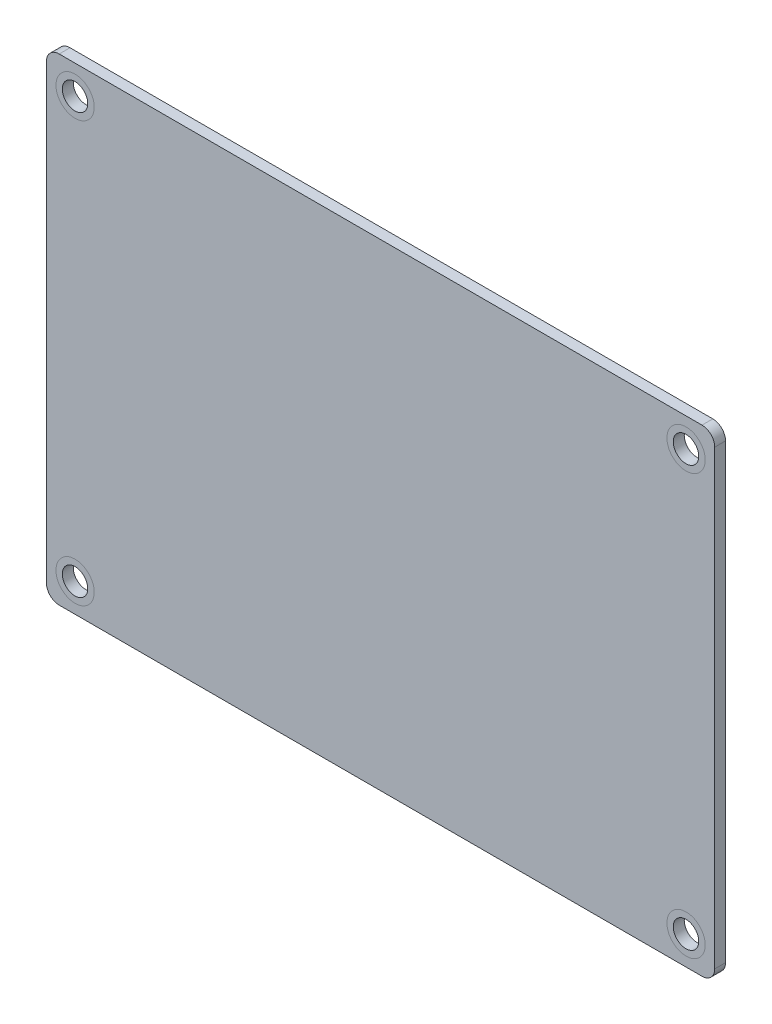
ISO-10303-21;
HEADER;
FILE_DESCRIPTION(('STEP AP214'),'2;1');
FILE_NAME('part.step','',(''),(''),'','','');
FILE_SCHEMA(('AUTOMOTIVE_DESIGN { 1 0 10303 214 1 1 1 1 }'));
ENDSEC;
DATA;
#1=APPLICATION_CONTEXT('core data for automotive mechanical design processes');
#2=APPLICATION_PROTOCOL_DEFINITION('international standard','automotive_design',2000,#1);
#3=PRODUCT_CONTEXT('',#1,'mechanical');
#4=PRODUCT('Part','Part','',(#3));
#5=PRODUCT_RELATED_PRODUCT_CATEGORY('part','',(#4));
#6=PRODUCT_DEFINITION_FORMATION('','',#4);
#7=PRODUCT_DEFINITION_CONTEXT('part definition',#1,'design');
#8=PRODUCT_DEFINITION('design','',#6,#7);
#9=PRODUCT_DEFINITION_SHAPE('','',#8);
#10=(LENGTH_UNIT() NAMED_UNIT(*) SI_UNIT(.MILLI.,.METRE.));
#11=(NAMED_UNIT(*) PLANE_ANGLE_UNIT() SI_UNIT($,.RADIAN.));
#12=(NAMED_UNIT(*) SI_UNIT($,.STERADIAN.) SOLID_ANGLE_UNIT());
#13=UNCERTAINTY_MEASURE_WITH_UNIT(LENGTH_MEASURE(1.E-05),#10,'distance_accuracy_value','');
#14=(GEOMETRIC_REPRESENTATION_CONTEXT(3) GLOBAL_UNCERTAINTY_ASSIGNED_CONTEXT((#13)) GLOBAL_UNIT_ASSIGNED_CONTEXT((#10,
#11,#12)) REPRESENTATION_CONTEXT('',''));
#15=CARTESIAN_POINT('',(0.,0.,0.));
#16=DIRECTION('',(0.,0.,1.));
#17=DIRECTION('',(1.,0.,0.));
#18=AXIS2_PLACEMENT_3D('',#15,#16,#17);
#19=CARTESIAN_POINT('',(-45.,40.,1.7));
#20=DIRECTION('',(1.,0.,0.));
#21=DIRECTION('',(0.,1.,0.));
#22=AXIS2_PLACEMENT_3D('',#19,#20,#21);
#23=PLANE('',#22);
#24=DIRECTION('',(0.,0.,-1.));
#25=VECTOR('',#24,1.);
#26=CARTESIAN_POINT('',(-45.00000000001,-33.00000000001,1.70000000001));
#27=LINE('',#26,#25);
#28=CARTESIAN_POINT('',(-45.,-33.,1.7));
#29=VERTEX_POINT('',#28);
#30=CARTESIAN_POINT('',(-45.,-33.,0.));
#31=VERTEX_POINT('',#30);
#32=EDGE_CURVE('E42',#29,#31,#27,.T.);
#33=ORIENTED_EDGE('',*,*,#32,.F.);
#34=DIRECTION('',(0.,1.,0.));
#35=VECTOR('',#34,1.);
#36=CARTESIAN_POINT('',(-45.00000000001,-33.00000000001,1.70000000001));
#37=LINE('',#36,#35);
#38=CARTESIAN_POINT('',(-45.,38.,1.7));
#39=VERTEX_POINT('',#38);
#40=EDGE_CURVE('E11',#29,#39,#37,.T.);
#41=ORIENTED_EDGE('',*,*,#40,.T.);
#42=DIRECTION('',(0.,0.,1.));
#43=VECTOR('',#42,1.);
#44=CARTESIAN_POINT('',(-45.00000000001,38.00000000001,0.));
#45=LINE('',#44,#43);
#46=CARTESIAN_POINT('',(-45.,38.,0.));
#47=VERTEX_POINT('',#46);
#48=EDGE_CURVE('E381',#47,#39,#45,.T.);
#49=ORIENTED_EDGE('',*,*,#48,.F.);
#50=DIRECTION('',(0.,1.,0.));
#51=VECTOR('',#50,1.);
#52=CARTESIAN_POINT('',(-45.00000000001,-33.00000000001,0.));
#53=LINE('',#52,#51);
#54=EDGE_CURVE('E377',#31,#47,#53,.T.);
#55=ORIENTED_EDGE('',*,*,#54,.F.);
#56=EDGE_LOOP('',(#33,#41,#49,#55));
#57=FACE_BOUND('',#56,.T.);
#58=ADVANCED_FACE('F17',(#57),#23,.F.);
#59=CARTESIAN_POINT('',(7.5,2.5,0.));
#60=DIRECTION('',(0.,0.,1.));
#61=DIRECTION('',(1.,0.,0.));
#62=AXIS2_PLACEMENT_3D('',#59,#60,#61);
#63=PLANE('',#62);
#64=CARTESIAN_POINT('',(-43.00000000001,-33.00000000001,0.));
#65=DIRECTION('',(0.,0.,-1.));
#66=DIRECTION('',(0.,-1.,0.));
#67=AXIS2_PLACEMENT_3D('',#64,#65,#66);
#68=CIRCLE('',#67,2.00000000001);
#69=CARTESIAN_POINT('',(-43.,-35.,0.));
#70=VERTEX_POINT('',#69);
#71=EDGE_CURVE('E30',#70,#31,#68,.T.);
#72=ORIENTED_EDGE('',*,*,#71,.T.);
#73=ORIENTED_EDGE('',*,*,#54,.T.);
#74=CARTESIAN_POINT('',(-43.00000000001,38.00000000001,0.));
#75=DIRECTION('',(0.,0.,-1.));
#76=DIRECTION('',(-1.,0.,0.));
#77=AXIS2_PLACEMENT_3D('',#74,#75,#76);
#78=CIRCLE('',#77,2.00000000001);
#79=CARTESIAN_POINT('',(-43.,40.,0.));
#80=VERTEX_POINT('',#79);
#81=EDGE_CURVE('E386',#47,#80,#78,.T.);
#82=ORIENTED_EDGE('',*,*,#81,.T.);
#83=DIRECTION('',(1.,0.,0.));
#84=VECTOR('',#83,1.);
#85=CARTESIAN_POINT('',(-43.00000000001,40.00000000001,0.));
#86=LINE('',#85,#84);
#87=CARTESIAN_POINT('',(58.,40.,0.));
#88=VERTEX_POINT('',#87);
#89=EDGE_CURVE('E136',#80,#88,#86,.T.);
#90=ORIENTED_EDGE('',*,*,#89,.T.);
#91=CARTESIAN_POINT('',(58.00000000001,38.00000000001,0.));
#92=DIRECTION('',(0.,0.,-1.));
#93=DIRECTION('',(0.,1.,0.));
#94=AXIS2_PLACEMENT_3D('',#91,#92,#93);
#95=CIRCLE('',#94,2.00000000001);
#96=CARTESIAN_POINT('',(60.,38.,0.));
#97=VERTEX_POINT('',#96);
#98=EDGE_CURVE('E128',#88,#97,#95,.T.);
#99=ORIENTED_EDGE('',*,*,#98,.T.);
#100=DIRECTION('',(0.,-1.,0.));
#101=VECTOR('',#100,1.);
#102=CARTESIAN_POINT('',(60.00000000001,38.00000000001,0.));
#103=LINE('',#102,#101);
#104=CARTESIAN_POINT('',(60.,-33.,0.));
#105=VERTEX_POINT('',#104);
#106=EDGE_CURVE('E336',#97,#105,#103,.T.);
#107=ORIENTED_EDGE('',*,*,#106,.T.);
#108=CARTESIAN_POINT('',(58.00000000001,-33.00000000001,0.));
#109=DIRECTION('',(0.,0.,-1.));
#110=DIRECTION('',(1.,0.,0.));
#111=AXIS2_PLACEMENT_3D('',#108,#109,#110);
#112=CIRCLE('',#111,2.00000000001);
#113=CARTESIAN_POINT('',(58.,-35.,0.));
#114=VERTEX_POINT('',#113);
#115=EDGE_CURVE('E340',#105,#114,#112,.T.);
#116=ORIENTED_EDGE('',*,*,#115,.T.);
#117=DIRECTION('',(-1.,0.,0.));
#118=VECTOR('',#117,1.);
#119=CARTESIAN_POINT('',(58.00000000001,-35.00000000001,0.));
#120=LINE('',#119,#118);
#121=EDGE_CURVE('E341',#114,#70,#120,.T.);
#122=ORIENTED_EDGE('',*,*,#121,.T.);
#123=EDGE_LOOP('',(#72,#73,#82,#90,#99,#107,#116,#122));
#124=FACE_BOUND('',#123,.T.);
#125=CARTESIAN_POINT('',(-37.50000000001,35.50000000001,-0.01));
#126=CARTESIAN_POINT('',(-37.5056913672193,34.2515518188258,-0.01));
#127=CARTESIAN_POINT('',(-38.3801267730283,33.3772478594267,-0.01));
#128=CARTESIAN_POINT('',(-39.2521991783295,32.5053065453256,-0.01));
#129=CARTESIAN_POINT('',(-40.4881974694983,32.5000405906666,-0.01));
#130=CARTESIAN_POINT('',(-41.7250646658958,32.4947709340483,-0.01));
#131=CARTESIAN_POINT('',(-42.6067692264733,33.364245327,-0.01));
#132=CARTESIAN_POINT('',(-43.4959996175382,34.2411411592716,-0.01));
#133=CARTESIAN_POINT('',(-43.50000000001,35.50000000001,-0.01));
#134=B_SPLINE_CURVE_WITH_KNOTS('',2,(#125,#126,#127,#128,#129,#130,#131,#132,#133),
.UNSPECIFIED.,.F.,.F.,(3,2,2,2,3),(0.,0.25,0.5,0.75,1.),.UNSPECIFIED.);
#135=CARTESIAN_POINT('',(-37.5,35.5,-0.005));
#136=VERTEX_POINT('',#135);
#137=CARTESIAN_POINT('',(-43.5,35.5,-0.005));
#138=VERTEX_POINT('',#137);
#139=EDGE_CURVE('E912',#136,#138,#134,.T.);
#140=ORIENTED_EDGE('',*,*,#139,.F.);
#141=CARTESIAN_POINT('',(-43.50000000001,35.50000000001,-0.01));
#142=CARTESIAN_POINT('',(-43.4943086328007,36.7484481811896,-0.01));
#143=CARTESIAN_POINT('',(-42.6198732269917,37.6227521405933,-0.01));
#144=CARTESIAN_POINT('',(-41.7478008216904,38.494693454699,-0.01));
#145=CARTESIAN_POINT('',(-40.5118025305217,38.4999594093533,-0.01));
#146=CARTESIAN_POINT('',(-39.2749353341196,38.5052290659672,-0.01));
#147=CARTESIAN_POINT('',(-38.3932307735467,37.63575467302,-0.01));
#148=CARTESIAN_POINT('',(-37.5040003824818,36.7588588407484,-0.01));
#149=CARTESIAN_POINT('',(-37.50000000001,35.50000000001,-0.01));
#150=B_SPLINE_CURVE_WITH_KNOTS('',2,(#141,#142,#143,#144,#145,#146,#147,#148,#149),
.UNSPECIFIED.,.F.,.F.,(3,2,2,2,3),(0.,0.25,0.5,0.75,1.),.UNSPECIFIED.);
#151=EDGE_CURVE('E320',#138,#136,#150,.T.);
#152=ORIENTED_EDGE('',*,*,#151,.F.);
#153=EDGE_LOOP('',(#140,#152));
#154=FACE_BOUND('',#153,.T.);
#155=CARTESIAN_POINT('',(58.50000000001,-30.50000000001,-0.01));
#156=CARTESIAN_POINT('',(58.4943086328008,-31.7484481811804,-0.01));
#157=CARTESIAN_POINT('',(57.6198732269917,-32.6227521405933,-0.01));
#158=CARTESIAN_POINT('',(56.747800821695,-33.4946934547035,-0.01));
#159=CARTESIAN_POINT('',(55.5118025305217,-33.4999594093533,-0.01));
#160=CARTESIAN_POINT('',(54.2749353341104,-33.5052290659626,-0.01));
#161=CARTESIAN_POINT('',(53.3932307735467,-32.63575467302,-0.01));
#162=CARTESIAN_POINT('',(52.5040003824818,-31.7588588407438,-0.01));
#163=CARTESIAN_POINT('',(52.50000000001,-30.50000000001,-0.01));
#164=B_SPLINE_CURVE_WITH_KNOTS('',2,(#155,#156,#157,#158,#159,#160,#161,#162,#163),
.UNSPECIFIED.,.F.,.F.,(3,2,2,2,3),(0.,0.25,0.5,0.75,1.),.UNSPECIFIED.);
#165=CARTESIAN_POINT('',(58.5,-30.5,-0.005));
#166=VERTEX_POINT('',#165);
#167=CARTESIAN_POINT('',(52.5,-30.5,-0.005));
#168=VERTEX_POINT('',#167);
#169=EDGE_CURVE('E366',#166,#168,#164,.T.);
#170=ORIENTED_EDGE('',*,*,#169,.F.);
#171=CARTESIAN_POINT('',(52.50000000001,-30.50000000001,-0.01));
#172=CARTESIAN_POINT('',(52.5056913672192,-29.2515518188373,-0.01));
#173=CARTESIAN_POINT('',(53.3801267730283,-28.3772478594267,-0.01));
#174=CARTESIAN_POINT('',(54.2521991783226,-27.5053065453211,-0.01));
#175=CARTESIAN_POINT('',(55.4881974694983,-27.5000405906667,-0.01));
#176=CARTESIAN_POINT('',(56.7250646659027,-27.4947709340528,-0.01));
#177=CARTESIAN_POINT('',(57.6067692264733,-28.364245327,-0.01));
#178=CARTESIAN_POINT('',(58.4959996175382,-29.241141159274,-0.01));
#179=CARTESIAN_POINT('',(58.50000000001,-30.50000000001,-0.01));
#180=B_SPLINE_CURVE_WITH_KNOTS('',2,(#171,#172,#173,#174,#175,#176,#177,#178,#179),
.UNSPECIFIED.,.F.,.F.,(3,2,2,2,3),(0.,0.25,0.5,0.75,1.),.UNSPECIFIED.);
#181=EDGE_CURVE('E350',#168,#166,#180,.T.);
#182=ORIENTED_EDGE('',*,*,#181,.F.);
#183=EDGE_LOOP('',(#170,#182));
#184=FACE_BOUND('',#183,.T.);
#185=CARTESIAN_POINT('',(58.50000000001,35.50000000001,-0.01));
#186=CARTESIAN_POINT('',(58.4943086328007,34.2515518188304,-0.01));
#187=CARTESIAN_POINT('',(57.6198732269917,33.3772478594267,-0.01));
#188=CARTESIAN_POINT('',(56.747800821695,32.5053065453256,-0.01));
#189=CARTESIAN_POINT('',(55.5118025305217,32.5000405906666,-0.01));
#190=CARTESIAN_POINT('',(54.2749353341196,32.4947709340482,-0.01));
#191=CARTESIAN_POINT('',(53.3932307735467,33.364245327,-0.01));
#192=CARTESIAN_POINT('',(52.5040003824818,34.2411411592762,-0.01));
#193=CARTESIAN_POINT('',(52.50000000001,35.50000000001,-0.01));
#194=B_SPLINE_CURVE_WITH_KNOTS('',2,(#185,#186,#187,#188,#189,#190,#191,#192,#193),
.UNSPECIFIED.,.F.,.F.,(3,2,2,2,3),(0.,0.25,0.5,0.75,1.),.UNSPECIFIED.);
#195=CARTESIAN_POINT('',(58.5,35.5,-0.005));
#196=VERTEX_POINT('',#195);
#197=CARTESIAN_POINT('',(52.5,35.5,-0.005));
#198=VERTEX_POINT('',#197);
#199=EDGE_CURVE('E309',#196,#198,#194,.T.);
#200=ORIENTED_EDGE('',*,*,#199,.F.);
#201=CARTESIAN_POINT('',(52.50000000001,35.50000000001,-0.01));
#202=CARTESIAN_POINT('',(52.5056913672192,36.748448181185,-0.01));
#203=CARTESIAN_POINT('',(53.3801267730283,37.6227521405933,-0.01));
#204=CARTESIAN_POINT('',(54.252199178325,38.4946934546989,-0.01));
#205=CARTESIAN_POINT('',(55.4881974694983,38.4999594093533,-0.01));
#206=CARTESIAN_POINT('',(56.7250646658959,38.5052290659672,-0.01));
#207=CARTESIAN_POINT('',(57.6067692264733,37.63575467302,-0.01));
#208=CARTESIAN_POINT('',(58.4959996175382,36.7588588407529,-0.01));
#209=CARTESIAN_POINT('',(58.50000000001,35.50000000001,-0.01));
#210=B_SPLINE_CURVE_WITH_KNOTS('',2,(#201,#202,#203,#204,#205,#206,#207,#208,#209),
.UNSPECIFIED.,.F.,.F.,(3,2,2,2,3),(0.,0.25,0.5,0.75,1.),.UNSPECIFIED.);
#211=EDGE_CURVE('E335',#198,#196,#210,.T.);
#212=ORIENTED_EDGE('',*,*,#211,.F.);
#213=EDGE_LOOP('',(#200,#212));
#214=FACE_BOUND('',#213,.T.);
#215=CARTESIAN_POINT('',(-37.50000000001,-30.50000000001,-0.01));
#216=CARTESIAN_POINT('',(-37.5056913672192,-31.748448181185,-0.01));
#217=CARTESIAN_POINT('',(-38.3801267730283,-32.6227521405933,-0.01));
#218=CARTESIAN_POINT('',(-39.2521991783295,-33.4946934547035,-0.01));
#219=CARTESIAN_POINT('',(-40.4881974694983,-33.4999594093533,-0.01));
#220=CARTESIAN_POINT('',(-41.7250646659051,-33.5052290659626,-0.01));
#221=CARTESIAN_POINT('',(-42.6067692264733,-32.63575467302,-0.01));
#222=CARTESIAN_POINT('',(-43.4959996175382,-31.7588588407484,-0.01));
#223=CARTESIAN_POINT('',(-43.50000000001,-30.50000000001,-0.01));
#224=B_SPLINE_CURVE_WITH_KNOTS('',2,(#215,#216,#217,#218,#219,#220,#221,#222,#223),
.UNSPECIFIED.,.F.,.F.,(3,2,2,2,3),(0.,0.25,0.5,0.75,1.),.UNSPECIFIED.);
#225=CARTESIAN_POINT('',(-37.5,-30.5,-0.005));
#226=VERTEX_POINT('',#225);
#227=CARTESIAN_POINT('',(-43.5,-30.5,-0.005));
#228=VERTEX_POINT('',#227);
#229=EDGE_CURVE('E370',#226,#228,#224,.T.);
#230=ORIENTED_EDGE('',*,*,#229,.F.);
#231=CARTESIAN_POINT('',(-43.50000000001,-30.50000000001,-0.01));
#232=CARTESIAN_POINT('',(-43.4943086328007,-29.2515518188327,-0.01));
#233=CARTESIAN_POINT('',(-42.6198732269917,-28.3772478594267,-0.01));
#234=CARTESIAN_POINT('',(-41.7478008216927,-27.505306545321,-0.01));
#235=CARTESIAN_POINT('',(-40.5118025305217,-27.5000405906667,-0.01));
#236=CARTESIAN_POINT('',(-39.2749353341127,-27.4947709340528,-0.01));
#237=CARTESIAN_POINT('',(-38.3932307735467,-28.364245327,-0.01));
#238=CARTESIAN_POINT('',(-37.5040003824818,-29.2411411592785,-0.01));
#239=CARTESIAN_POINT('',(-37.50000000001,-30.50000000001,-0.01));
#240=B_SPLINE_CURVE_WITH_KNOTS('',2,(#231,#232,#233,#234,#235,#236,#237,#238,#239),
.UNSPECIFIED.,.F.,.F.,(3,2,2,2,3),(0.,0.25,0.5,0.75,1.),.UNSPECIFIED.);
#241=EDGE_CURVE('E344',#228,#226,#240,.T.);
#242=ORIENTED_EDGE('',*,*,#241,.F.);
#243=EDGE_LOOP('',(#230,#242));
#244=FACE_BOUND('',#243,.T.);
#245=ADVANCED_FACE('F412',(#124,#154,#184,#214,#244),#63,.F.);
#246=CARTESIAN_POINT('',(-40.5,-30.5,-0.01));
#247=DIRECTION('',(0.,0.,1.));
#248=DIRECTION('',(1.,0.,0.));
#249=AXIS2_PLACEMENT_3D('',#246,#247,#248);
#250=PLANE('',#249);
#251=ORIENTED_EDGE('',*,*,#241,.T.);
#252=ORIENTED_EDGE('',*,*,#229,.T.);
#253=EDGE_LOOP('',(#251,#252));
#254=FACE_BOUND('',#253,.T.);
#255=CARTESIAN_POINT('',(-40.50000000001,-30.50000000001,-0.01000000001));
#256=DIRECTION('',(0.,0.,1.));
#257=DIRECTION('',(-1.,0.,0.));
#258=AXIS2_PLACEMENT_3D('',#255,#256,#257);
#259=CIRCLE('',#258,2.00000000001);
#260=CARTESIAN_POINT('',(-42.50000000002,-30.50000000001,-0.01000000001));
#261=VERTEX_POINT('',#260);
#262=EDGE_CURVE('E359',#261,#261,#259,.T.);
#263=ORIENTED_EDGE('',*,*,#262,.T.);
#264=EDGE_LOOP('',(#263));
#265=FACE_BOUND('',#264,.T.);
#266=ADVANCED_FACE('F401',(#254,#265),#250,.F.);
#267=CARTESIAN_POINT('',(-40.5,-30.5,1.7));
#268=DIRECTION('',(0.,0.,-1.));
#269=DIRECTION('',(-1.,0.,0.));
#270=AXIS2_PLACEMENT_3D('',#267,#268,#269);
#271=CYLINDRICAL_SURFACE('',#270,2.);
#272=ORIENTED_EDGE('',*,*,#262,.F.);
#273=EDGE_LOOP('',(#272));
#274=FACE_BOUND('',#273,.T.);
#275=CARTESIAN_POINT('',(-40.50000000001,-30.50000000001,1.71000000001));
#276=DIRECTION('',(0.,0.,-1.));
#277=DIRECTION('',(-1.,0.,0.));
#278=AXIS2_PLACEMENT_3D('',#275,#276,#277);
#279=CIRCLE('',#278,2.00000000001);
#280=CARTESIAN_POINT('',(-42.50000000002,-30.50000000001,1.71000000001));
#281=VERTEX_POINT('',#280);
#282=EDGE_CURVE('E325',#281,#281,#279,.T.);
#283=ORIENTED_EDGE('',*,*,#282,.F.);
#284=EDGE_LOOP('',(#283));
#285=FACE_BOUND('',#284,.T.);
#286=ADVANCED_FACE('F411',(#274,#285),#271,.F.);
#287=CARTESIAN_POINT('',(-40.5,-30.5,1.71));
#288=DIRECTION('',(0.,0.,1.));
#289=DIRECTION('',(1.,0.,0.));
#290=AXIS2_PLACEMENT_3D('',#287,#288,#289);
#291=PLANE('',#290);
#292=CARTESIAN_POINT('',(-37.50000000001,-30.50000000001,1.7));
#293=CARTESIAN_POINT('',(-37.5056913672193,-31.748448181185,1.7));
#294=CARTESIAN_POINT('',(-38.3801267730283,-32.6227521405933,1.7));
#295=CARTESIAN_POINT('',(-39.2521991783296,-33.4946934547035,1.7));
#296=CARTESIAN_POINT('',(-40.4881974694983,-33.4999594093534,1.7));
#297=CARTESIAN_POINT('',(-41.7250646659051,-33.5052290659626,1.7));
#298=CARTESIAN_POINT('',(-42.6067692264733,-32.63575467302,1.7));
#299=CARTESIAN_POINT('',(-43.4959996175382,-31.7588588407484,1.7));
#300=CARTESIAN_POINT('',(-43.50000000001,-30.50000000001,1.7));
#301=B_SPLINE_CURVE_WITH_KNOTS('',2,(#292,#293,#294,#295,#296,#297,#298,#299,#300),
.UNSPECIFIED.,.F.,.F.,(3,2,2,2,3),(0.,0.25,0.5,0.75,1.),.UNSPECIFIED.);
#302=CARTESIAN_POINT('',(-37.5,-30.5,1.705));
#303=VERTEX_POINT('',#302);
#304=CARTESIAN_POINT('',(-43.5,-30.5,1.705));
#305=VERTEX_POINT('',#304);
#306=EDGE_CURVE('E178',#303,#305,#301,.T.);
#307=ORIENTED_EDGE('',*,*,#306,.F.);
#308=CARTESIAN_POINT('',(-43.50000000001,-30.50000000001,1.7));
#309=CARTESIAN_POINT('',(-43.4943086328007,-29.2515518188327,1.7));
#310=CARTESIAN_POINT('',(-42.6198732269917,-28.3772478594267,1.7));
#311=CARTESIAN_POINT('',(-41.7478008216927,-27.505306545321,1.7));
#312=CARTESIAN_POINT('',(-40.5118025305217,-27.5000405906667,1.7));
#313=CARTESIAN_POINT('',(-39.2749353341127,-27.4947709340528,1.7));
#314=CARTESIAN_POINT('',(-38.3932307735467,-28.364245327,1.7));
#315=CARTESIAN_POINT('',(-37.5040003824818,-29.2411411592785,1.7));
#316=CARTESIAN_POINT('',(-37.50000000001,-30.50000000001,1.7));
#317=B_SPLINE_CURVE_WITH_KNOTS('',2,(#308,#309,#310,#311,#312,#313,#314,#315,#316),
.UNSPECIFIED.,.F.,.F.,(3,2,2,2,3),(0.,0.25,0.5,0.75,1.),.UNSPECIFIED.);
#318=EDGE_CURVE('E183',#305,#303,#317,.T.);
#319=ORIENTED_EDGE('',*,*,#318,.F.);
#320=EDGE_LOOP('',(#307,#319));
#321=FACE_BOUND('',#320,.T.);
#322=ORIENTED_EDGE('',*,*,#282,.T.);
#323=EDGE_LOOP('',(#322));
#324=FACE_BOUND('',#323,.T.);
#325=ADVANCED_FACE('F181',(#321,#324),#291,.T.);
#326=CARTESIAN_POINT('',(7.5,2.5,1.7));
#327=DIRECTION('',(0.,0.,1.));
#328=DIRECTION('',(1.,0.,0.));
#329=AXIS2_PLACEMENT_3D('',#326,#327,#328);
#330=PLANE('',#329);
#331=CARTESIAN_POINT('',(-43.00000000001,-33.00000000001,1.70000000001));
#332=DIRECTION('',(0.,0.,1.));
#333=DIRECTION('',(-1.,0.,0.));
#334=AXIS2_PLACEMENT_3D('',#331,#332,#333);
#335=CIRCLE('',#334,2.00000000001);
#336=CARTESIAN_POINT('',(-43.,-35.,1.7));
#337=VERTEX_POINT('',#336);
#338=EDGE_CURVE('E321',#29,#337,#335,.T.);
#339=ORIENTED_EDGE('',*,*,#338,.T.);
#340=DIRECTION('',(-1.,0.,0.));
#341=VECTOR('',#340,1.);
#342=CARTESIAN_POINT('',(58.00000000001,-35.00000000001,1.70000000001));
#343=LINE('',#342,#341);
#344=CARTESIAN_POINT('',(58.,-35.,1.7));
#345=VERTEX_POINT('',#344);
#346=EDGE_CURVE('E316',#345,#337,#343,.T.);
#347=ORIENTED_EDGE('',*,*,#346,.F.);
#348=CARTESIAN_POINT('',(58.00000000001,-33.00000000001,1.70000000001));
#349=DIRECTION('',(0.,0.,1.));
#350=DIRECTION('',(0.,-1.,0.));
#351=AXIS2_PLACEMENT_3D('',#348,#349,#350);
#352=CIRCLE('',#351,2.00000000001);
#353=CARTESIAN_POINT('',(60.,-33.,1.7));
#354=VERTEX_POINT('',#353);
#355=EDGE_CURVE('E301',#345,#354,#352,.T.);
#356=ORIENTED_EDGE('',*,*,#355,.T.);
#357=DIRECTION('',(0.,-1.,0.));
#358=VECTOR('',#357,1.);
#359=CARTESIAN_POINT('',(60.00000000001,38.00000000001,1.70000000001));
#360=LINE('',#359,#358);
#361=CARTESIAN_POINT('',(60.,38.,1.7));
#362=VERTEX_POINT('',#361);
#363=EDGE_CURVE('E326',#362,#354,#360,.T.);
#364=ORIENTED_EDGE('',*,*,#363,.F.);
#365=CARTESIAN_POINT('',(58.00000000001,38.00000000001,1.70000000001));
#366=DIRECTION('',(0.,0.,1.));
#367=DIRECTION('',(1.,0.,0.));
#368=AXIS2_PLACEMENT_3D('',#365,#366,#367);
#369=CIRCLE('',#368,2.00000000001);
#370=CARTESIAN_POINT('',(58.,40.,1.7));
#371=VERTEX_POINT('',#370);
#372=EDGE_CURVE('E295',#362,#371,#369,.T.);
#373=ORIENTED_EDGE('',*,*,#372,.T.);
#374=DIRECTION('',(1.,0.,0.));
#375=VECTOR('',#374,1.);
#376=CARTESIAN_POINT('',(-43.00000000001,40.00000000001,1.70000000001));
#377=LINE('',#376,#375);
#378=CARTESIAN_POINT('',(-43.,40.,1.7));
#379=VERTEX_POINT('',#378);
#380=EDGE_CURVE('E378',#379,#371,#377,.T.);
#381=ORIENTED_EDGE('',*,*,#380,.F.);
#382=CARTESIAN_POINT('',(-43.00000000001,38.00000000001,1.70000000001));
#383=DIRECTION('',(0.,0.,1.));
#384=DIRECTION('',(0.,1.,0.));
#385=AXIS2_PLACEMENT_3D('',#382,#383,#384);
#386=CIRCLE('',#385,2.00000000001);
#387=EDGE_CURVE('E290',#379,#39,#386,.T.);
#388=ORIENTED_EDGE('',*,*,#387,.T.);
#389=ORIENTED_EDGE('',*,*,#40,.F.);
#390=EDGE_LOOP('',(#339,#347,#356,#364,#373,#381,#388,#389));
#391=FACE_BOUND('',#390,.T.);
#392=CARTESIAN_POINT('',(-43.50000000001,35.50000000001,1.7));
#393=CARTESIAN_POINT('',(-43.4943086328007,36.7484481811896,1.7));
#394=CARTESIAN_POINT('',(-42.6198732269917,37.6227521405933,1.7));
#395=CARTESIAN_POINT('',(-41.7478008216904,38.4946934546989,1.7));
#396=CARTESIAN_POINT('',(-40.5118025305217,38.4999594093534,1.7));
#397=CARTESIAN_POINT('',(-39.2749353341196,38.5052290659671,1.7));
#398=CARTESIAN_POINT('',(-38.3932307735467,37.63575467302,1.7));
#399=CARTESIAN_POINT('',(-37.5040003824818,36.7588588407485,1.7));
#400=CARTESIAN_POINT('',(-37.50000000001,35.50000000001,1.7));
#401=B_SPLINE_CURVE_WITH_KNOTS('',2,(#392,#393,#394,#395,#396,#397,#398,#399,#400),
.UNSPECIFIED.,.F.,.F.,(3,2,2,2,3),(0.,0.25,0.5,0.75,1.),.UNSPECIFIED.);
#402=CARTESIAN_POINT('',(-43.5,35.5,1.705));
#403=VERTEX_POINT('',#402);
#404=CARTESIAN_POINT('',(-37.5,35.5,1.705));
#405=VERTEX_POINT('',#404);
#406=EDGE_CURVE('E284',#403,#405,#401,.T.);
#407=ORIENTED_EDGE('',*,*,#406,.T.);
#408=CARTESIAN_POINT('',(-37.50000000001,35.50000000001,1.7));
#409=CARTESIAN_POINT('',(-37.5056913672193,34.2515518188259,1.7));
#410=CARTESIAN_POINT('',(-38.3801267730283,33.3772478594267,1.7));
#411=CARTESIAN_POINT('',(-39.2521991783295,32.5053065453256,1.7));
#412=CARTESIAN_POINT('',(-40.4881974694983,32.5000405906667,1.7));
#413=CARTESIAN_POINT('',(-41.7250646658958,32.4947709340482,1.7));
#414=CARTESIAN_POINT('',(-42.6067692264733,33.364245327,1.7));
#415=CARTESIAN_POINT('',(-43.4959996175382,34.2411411592716,1.7));
#416=CARTESIAN_POINT('',(-43.50000000001,35.50000000001,1.7));
#417=B_SPLINE_CURVE_WITH_KNOTS('',2,(#408,#409,#410,#411,#412,#413,#414,#415,#416),
.UNSPECIFIED.,.F.,.F.,(3,2,2,2,3),(0.,0.25,0.5,0.75,1.),.UNSPECIFIED.);
#418=EDGE_CURVE('E280',#405,#403,#417,.T.);
#419=ORIENTED_EDGE('',*,*,#418,.T.);
#420=EDGE_LOOP('',(#407,#419));
#421=FACE_BOUND('',#420,.T.);
#422=CARTESIAN_POINT('',(52.50000000001,-30.50000000001,1.7));
#423=CARTESIAN_POINT('',(52.5056913672192,-29.2515518188373,1.7));
#424=CARTESIAN_POINT('',(53.3801267730283,-28.3772478594267,1.7));
#425=CARTESIAN_POINT('',(54.2521991783227,-27.5053065453211,1.7));
#426=CARTESIAN_POINT('',(55.4881974694983,-27.5000405906667,1.7));
#427=CARTESIAN_POINT('',(56.7250646659027,-27.4947709340528,1.7));
#428=CARTESIAN_POINT('',(57.6067692264733,-28.364245327,1.7));
#429=CARTESIAN_POINT('',(58.4959996175382,-29.241141159274,1.7));
#430=CARTESIAN_POINT('',(58.50000000001,-30.50000000001,1.7));
#431=B_SPLINE_CURVE_WITH_KNOTS('',2,(#422,#423,#424,#425,#426,#427,#428,#429,#430),
.UNSPECIFIED.,.F.,.F.,(3,2,2,2,3),(0.,0.25,0.5,0.75,1.),.UNSPECIFIED.);
#432=CARTESIAN_POINT('',(52.5,-30.5,1.705));
#433=VERTEX_POINT('',#432);
#434=CARTESIAN_POINT('',(58.5,-30.5,1.705));
#435=VERTEX_POINT('',#434);
#436=EDGE_CURVE('E275',#433,#435,#431,.T.);
#437=ORIENTED_EDGE('',*,*,#436,.T.);
#438=CARTESIAN_POINT('',(58.50000000001,-30.50000000001,1.7));
#439=CARTESIAN_POINT('',(58.4943086328008,-31.7484481811804,1.7));
#440=CARTESIAN_POINT('',(57.6198732269917,-32.6227521405933,1.7));
#441=CARTESIAN_POINT('',(56.747800821695,-33.4946934547035,1.7));
#442=CARTESIAN_POINT('',(55.5118025305217,-33.4999594093534,1.7));
#443=CARTESIAN_POINT('',(54.2749353341104,-33.5052290659627,1.7));
#444=CARTESIAN_POINT('',(53.3932307735467,-32.63575467302,1.7));
#445=CARTESIAN_POINT('',(52.5040003824818,-31.7588588407439,1.7));
#446=CARTESIAN_POINT('',(52.50000000001,-30.50000000001,1.7));
#447=B_SPLINE_CURVE_WITH_KNOTS('',2,(#438,#439,#440,#441,#442,#443,#444,#445,#446),
.UNSPECIFIED.,.F.,.F.,(3,2,2,2,3),(0.,0.25,0.5,0.75,1.),.UNSPECIFIED.);
#448=EDGE_CURVE('E271',#435,#433,#447,.T.);
#449=ORIENTED_EDGE('',*,*,#448,.T.);
#450=EDGE_LOOP('',(#437,#449));
#451=FACE_BOUND('',#450,.T.);
#452=CARTESIAN_POINT('',(52.50000000001,35.50000000001,1.7));
#453=CARTESIAN_POINT('',(52.5056913672192,36.7484481811775,1.7));
#454=CARTESIAN_POINT('',(53.3801267730266,37.6227521405933,1.7));
#455=CARTESIAN_POINT('',(54.2521991783141,38.4946934546989,1.7));
#456=CARTESIAN_POINT('',(55.4881974694983,38.4999594093534,1.7));
#457=CARTESIAN_POINT('',(56.7250646658959,38.5052290659671,1.7));
#458=CARTESIAN_POINT('',(57.6067692264733,37.63575467302,1.7));
#459=CARTESIAN_POINT('',(58.4959996175382,36.7588588407529,1.7));
#460=CARTESIAN_POINT('',(58.50000000001,35.50000000001,1.7));
#461=B_SPLINE_CURVE_WITH_KNOTS('',2,(#452,#453,#454,#455,#456,#457,#458,#459,#460),
.UNSPECIFIED.,.F.,.F.,(3,2,2,2,3),(0.,0.25,0.5,0.75,1.),.UNSPECIFIED.);
#462=CARTESIAN_POINT('',(52.5,35.5,1.705));
#463=VERTEX_POINT('',#462);
#464=CARTESIAN_POINT('',(58.5,35.5,1.705));
#465=VERTEX_POINT('',#464);
#466=EDGE_CURVE('E266',#463,#465,#461,.T.);
#467=ORIENTED_EDGE('',*,*,#466,.T.);
#468=CARTESIAN_POINT('',(58.50000000001,35.50000000001,1.7));
#469=CARTESIAN_POINT('',(58.4943086328007,34.2515518188304,1.7));
#470=CARTESIAN_POINT('',(57.6198732269917,33.3772478594267,1.7));
#471=CARTESIAN_POINT('',(56.747800821695,32.5053065453256,1.7));
#472=CARTESIAN_POINT('',(55.5118025305217,32.5000405906667,1.7));
#473=CARTESIAN_POINT('',(54.2749353341196,32.4947709340482,1.7));
#474=CARTESIAN_POINT('',(53.3932307735467,33.364245327,1.7));
#475=CARTESIAN_POINT('',(52.5040003824818,34.2411411592762,1.7));
#476=CARTESIAN_POINT('',(52.50000000001,35.50000000001,1.7));
#477=B_SPLINE_CURVE_WITH_KNOTS('',2,(#468,#469,#470,#471,#472,#473,#474,#475,#476),
.UNSPECIFIED.,.F.,.F.,(3,2,2,2,3),(0.,0.25,0.5,0.75,1.),.UNSPECIFIED.);
#478=EDGE_CURVE('E194',#465,#463,#477,.T.);
#479=ORIENTED_EDGE('',*,*,#478,.T.);
#480=EDGE_LOOP('',(#467,#479));
#481=FACE_BOUND('',#480,.T.);
#482=ORIENTED_EDGE('',*,*,#318,.T.);
#483=ORIENTED_EDGE('',*,*,#306,.T.);
#484=EDGE_LOOP('',(#482,#483));
#485=FACE_BOUND('',#484,.T.);
#486=ADVANCED_FACE('F192',(#391,#421,#451,#481,#485),#330,.T.);
#487=CARTESIAN_POINT('',(-40.5,35.5,1.71));
#488=DIRECTION('',(0.,0.,1.));
#489=DIRECTION('',(1.,0.,0.));
#490=AXIS2_PLACEMENT_3D('',#487,#488,#489);
#491=PLANE('',#490);
#492=ORIENTED_EDGE('',*,*,#418,.F.);
#493=ORIENTED_EDGE('',*,*,#406,.F.);
#494=EDGE_LOOP('',(#492,#493));
#495=FACE_BOUND('',#494,.T.);
#496=CARTESIAN_POINT('',(-40.50000000001,35.50000000001,1.71000000001));
#497=DIRECTION('',(0.,0.,-1.));
#498=DIRECTION('',(-1.,0.,0.));
#499=AXIS2_PLACEMENT_3D('',#496,#497,#498);
#500=CIRCLE('',#499,2.00000000001);
#501=CARTESIAN_POINT('',(-42.50000000002,35.50000000001,1.71000000001));
#502=VERTEX_POINT('',#501);
#503=EDGE_CURVE('E188',#502,#502,#500,.T.);
#504=ORIENTED_EDGE('',*,*,#503,.T.);
#505=EDGE_LOOP('',(#504));
#506=FACE_BOUND('',#505,.T.);
#507=ADVANCED_FACE('F214',(#495,#506),#491,.T.);
#508=CARTESIAN_POINT('',(-40.5,35.5,1.7));
#509=DIRECTION('',(0.,0.,-1.));
#510=DIRECTION('',(-1.,0.,0.));
#511=AXIS2_PLACEMENT_3D('',#508,#509,#510);
#512=CYLINDRICAL_SURFACE('',#511,2.);
#513=CARTESIAN_POINT('',(-40.50000000001,35.50000000001,-0.01000000001));
#514=DIRECTION('',(0.,0.,1.));
#515=DIRECTION('',(-1.,0.,0.));
#516=AXIS2_PLACEMENT_3D('',#513,#514,#515);
#517=CIRCLE('',#516,2.00000000001);
#518=CARTESIAN_POINT('',(-42.50000000002,35.50000000001,-0.01000000001));
#519=VERTEX_POINT('',#518);
#520=EDGE_CURVE('E349',#519,#519,#517,.T.);
#521=ORIENTED_EDGE('',*,*,#520,.F.);
#522=EDGE_LOOP('',(#521));
#523=FACE_BOUND('',#522,.T.);
#524=ORIENTED_EDGE('',*,*,#503,.F.);
#525=EDGE_LOOP('',(#524));
#526=FACE_BOUND('',#525,.T.);
#527=ADVANCED_FACE('F583',(#523,#526),#512,.F.);
#528=CARTESIAN_POINT('',(-40.5,35.5,-0.01));
#529=DIRECTION('',(0.,0.,1.));
#530=DIRECTION('',(1.,0.,0.));
#531=AXIS2_PLACEMENT_3D('',#528,#529,#530);
#532=PLANE('',#531);
#533=ORIENTED_EDGE('',*,*,#151,.T.);
#534=ORIENTED_EDGE('',*,*,#139,.T.);
#535=EDGE_LOOP('',(#533,#534));
#536=FACE_BOUND('',#535,.T.);
#537=ORIENTED_EDGE('',*,*,#520,.T.);
#538=EDGE_LOOP('',(#537));
#539=FACE_BOUND('',#538,.T.);
#540=ADVANCED_FACE('F592',(#536,#539),#532,.F.);
#541=CARTESIAN_POINT('',(55.5,-30.5,1.71));
#542=DIRECTION('',(0.,0.,1.));
#543=DIRECTION('',(1.,0.,0.));
#544=AXIS2_PLACEMENT_3D('',#541,#542,#543);
#545=PLANE('',#544);
#546=ORIENTED_EDGE('',*,*,#448,.F.);
#547=ORIENTED_EDGE('',*,*,#436,.F.);
#548=EDGE_LOOP('',(#546,#547));
#549=FACE_BOUND('',#548,.T.);
#550=CARTESIAN_POINT('',(55.50000000001,-30.50000000001,1.71000000001));
#551=DIRECTION('',(0.,0.,-1.));
#552=DIRECTION('',(-1.,0.,0.));
#553=AXIS2_PLACEMENT_3D('',#550,#551,#552);
#554=CIRCLE('',#553,2.00000000001);
#555=CARTESIAN_POINT('',(53.5,-30.50000000001,1.71000000001));
#556=VERTEX_POINT('',#555);
#557=EDGE_CURVE('E345',#556,#556,#554,.T.);
#558=ORIENTED_EDGE('',*,*,#557,.T.);
#559=EDGE_LOOP('',(#558));
#560=FACE_BOUND('',#559,.T.);
#561=ADVANCED_FACE('F600',(#549,#560),#545,.T.);
#562=CARTESIAN_POINT('',(55.5,-30.5,1.7));
#563=DIRECTION('',(0.,0.,-1.));
#564=DIRECTION('',(-1.,0.,0.));
#565=AXIS2_PLACEMENT_3D('',#562,#563,#564);
#566=CYLINDRICAL_SURFACE('',#565,2.);
#567=CARTESIAN_POINT('',(55.50000000001,-30.50000000001,-0.01000000001));
#568=DIRECTION('',(0.,0.,1.));
#569=DIRECTION('',(-1.,0.,0.));
#570=AXIS2_PLACEMENT_3D('',#567,#568,#569);
#571=CIRCLE('',#570,2.00000000001);
#572=CARTESIAN_POINT('',(53.5,-30.50000000001,-0.01000000001));
#573=VERTEX_POINT('',#572);
#574=EDGE_CURVE('E334',#573,#573,#571,.T.);
#575=ORIENTED_EDGE('',*,*,#574,.F.);
#576=EDGE_LOOP('',(#575));
#577=FACE_BOUND('',#576,.T.);
#578=ORIENTED_EDGE('',*,*,#557,.F.);
#579=EDGE_LOOP('',(#578));
#580=FACE_BOUND('',#579,.T.);
#581=ADVANCED_FACE('F413',(#577,#580),#566,.F.);
#582=CARTESIAN_POINT('',(55.5,-30.5,-0.01));
#583=DIRECTION('',(0.,0.,1.));
#584=DIRECTION('',(1.,0.,0.));
#585=AXIS2_PLACEMENT_3D('',#582,#583,#584);
#586=PLANE('',#585);
#587=ORIENTED_EDGE('',*,*,#181,.T.);
#588=ORIENTED_EDGE('',*,*,#169,.T.);
#589=EDGE_LOOP('',(#587,#588));
#590=FACE_BOUND('',#589,.T.);
#591=ORIENTED_EDGE('',*,*,#574,.T.);
#592=EDGE_LOOP('',(#591));
#593=FACE_BOUND('',#592,.T.);
#594=ADVANCED_FACE('F444',(#590,#593),#586,.F.);
#595=CARTESIAN_POINT('',(55.5,35.5,1.71));
#596=DIRECTION('',(0.,0.,1.));
#597=DIRECTION('',(1.,0.,0.));
#598=AXIS2_PLACEMENT_3D('',#595,#596,#597);
#599=PLANE('',#598);
#600=ORIENTED_EDGE('',*,*,#478,.F.);
#601=ORIENTED_EDGE('',*,*,#466,.F.);
#602=EDGE_LOOP('',(#600,#601));
#603=FACE_BOUND('',#602,.T.);
#604=CARTESIAN_POINT('',(55.50000000001,35.50000000001,1.71000000001));
#605=DIRECTION('',(0.,0.,-1.));
#606=DIRECTION('',(-1.,0.,0.));
#607=AXIS2_PLACEMENT_3D('',#604,#605,#606);
#608=CIRCLE('',#607,2.00000000001);
#609=CARTESIAN_POINT('',(53.5,35.50000000001,1.71000000001));
#610=VERTEX_POINT('',#609);
#611=EDGE_CURVE('E330',#610,#610,#608,.T.);
#612=ORIENTED_EDGE('',*,*,#611,.T.);
#613=EDGE_LOOP('',(#612));
#614=FACE_BOUND('',#613,.T.);
#615=ADVANCED_FACE('F264',(#603,#614),#599,.T.);
#616=CARTESIAN_POINT('',(55.5,35.5,1.7));
#617=DIRECTION('',(0.,0.,-1.));
#618=DIRECTION('',(-1.,0.,0.));
#619=AXIS2_PLACEMENT_3D('',#616,#617,#618);
#620=CYLINDRICAL_SURFACE('',#619,2.);
#621=CARTESIAN_POINT('',(55.50000000001,35.50000000001,-0.01000000001));
#622=DIRECTION('',(0.,0.,1.));
#623=DIRECTION('',(-1.,0.,0.));
#624=AXIS2_PLACEMENT_3D('',#621,#622,#623);
#625=CIRCLE('',#624,2.00000000001);
#626=CARTESIAN_POINT('',(53.5,35.50000000001,-0.01000000001));
#627=VERTEX_POINT('',#626);
#628=EDGE_CURVE('E305',#627,#627,#625,.T.);
#629=ORIENTED_EDGE('',*,*,#628,.F.);
#630=EDGE_LOOP('',(#629));
#631=FACE_BOUND('',#630,.T.);
#632=ORIENTED_EDGE('',*,*,#611,.F.);
#633=EDGE_LOOP('',(#632));
#634=FACE_BOUND('',#633,.T.);
#635=ADVANCED_FACE('F502',(#631,#634),#620,.F.);
#636=CARTESIAN_POINT('',(55.5,35.5,-0.01));
#637=DIRECTION('',(0.,0.,1.));
#638=DIRECTION('',(1.,0.,0.));
#639=AXIS2_PLACEMENT_3D('',#636,#637,#638);
#640=PLANE('',#639);
#641=ORIENTED_EDGE('',*,*,#211,.T.);
#642=ORIENTED_EDGE('',*,*,#199,.T.);
#643=EDGE_LOOP('',(#641,#642));
#644=FACE_BOUND('',#643,.T.);
#645=ORIENTED_EDGE('',*,*,#628,.T.);
#646=EDGE_LOOP('',(#645));
#647=FACE_BOUND('',#646,.T.);
#648=ADVANCED_FACE('F493',(#644,#647),#640,.F.);
#649=CARTESIAN_POINT('',(-43.,38.,1.7));
#650=DIRECTION('',(0.,0.,-1.));
#651=DIRECTION('',(-1.,0.,0.));
#652=AXIS2_PLACEMENT_3D('',#649,#650,#651);
#653=CYLINDRICAL_SURFACE('',#652,2.);
#654=DIRECTION('',(0.,0.,-1.));
#655=VECTOR('',#654,1.);
#656=CARTESIAN_POINT('',(-43.00000000001,40.00000000001,1.70000000001));
#657=LINE('',#656,#655);
#658=EDGE_CURVE('E310',#379,#80,#657,.T.);
#659=ORIENTED_EDGE('',*,*,#658,.T.);
#660=ORIENTED_EDGE('',*,*,#81,.F.);
#661=ORIENTED_EDGE('',*,*,#48,.T.);
#662=ORIENTED_EDGE('',*,*,#387,.F.);
#663=EDGE_LOOP('',(#659,#660,#661,#662));
#664=FACE_BOUND('',#663,.T.);
#665=ADVANCED_FACE('F415',(#664),#653,.T.);
#666=CARTESIAN_POINT('',(60.,40.,1.7));
#667=DIRECTION('',(0.,-1.,0.));
#668=DIRECTION('',(0.,0.,-1.));
#669=AXIS2_PLACEMENT_3D('',#666,#667,#668);
#670=PLANE('',#669);
#671=DIRECTION('',(0.,0.,1.));
#672=VECTOR('',#671,1.);
#673=CARTESIAN_POINT('',(58.00000000001,40.00000000001,0.));
#674=LINE('',#673,#672);
#675=EDGE_CURVE('E329',#88,#371,#674,.T.);
#676=ORIENTED_EDGE('',*,*,#675,.F.);
#677=ORIENTED_EDGE('',*,*,#89,.F.);
#678=ORIENTED_EDGE('',*,*,#658,.F.);
#679=ORIENTED_EDGE('',*,*,#380,.T.);
#680=EDGE_LOOP('',(#676,#677,#678,#679));
#681=FACE_BOUND('',#680,.T.);
#682=ADVANCED_FACE('F19',(#681),#670,.F.);
#683=CARTESIAN_POINT('',(58.,38.,1.7));
#684=DIRECTION('',(0.,0.,-1.));
#685=DIRECTION('',(-1.,0.,0.));
#686=AXIS2_PLACEMENT_3D('',#683,#684,#685);
#687=CYLINDRICAL_SURFACE('',#686,2.);
#688=DIRECTION('',(0.,0.,-1.));
#689=VECTOR('',#688,1.);
#690=CARTESIAN_POINT('',(60.00000000001,38.00000000001,1.70000000001));
#691=LINE('',#690,#689);
#692=EDGE_CURVE('E382',#362,#97,#691,.T.);
#693=ORIENTED_EDGE('',*,*,#692,.T.);
#694=ORIENTED_EDGE('',*,*,#98,.F.);
#695=ORIENTED_EDGE('',*,*,#675,.T.);
#696=ORIENTED_EDGE('',*,*,#372,.F.);
#697=EDGE_LOOP('',(#693,#694,#695,#696));
#698=FACE_BOUND('',#697,.T.);
#699=ADVANCED_FACE('F442',(#698),#687,.T.);
#700=CARTESIAN_POINT('',(60.,-35.,1.7));
#701=DIRECTION('',(-1.,0.,0.));
#702=DIRECTION('',(0.,0.,1.));
#703=AXIS2_PLACEMENT_3D('',#700,#701,#702);
#704=PLANE('',#703);
#705=DIRECTION('',(0.,0.,1.));
#706=VECTOR('',#705,1.);
#707=CARTESIAN_POINT('',(60.00000000001,-33.00000000001,0.));
#708=LINE('',#707,#706);
#709=EDGE_CURVE('E311',#105,#354,#708,.T.);
#710=ORIENTED_EDGE('',*,*,#709,.F.);
#711=ORIENTED_EDGE('',*,*,#106,.F.);
#712=ORIENTED_EDGE('',*,*,#692,.F.);
#713=ORIENTED_EDGE('',*,*,#363,.T.);
#714=EDGE_LOOP('',(#710,#711,#712,#713));
#715=FACE_BOUND('',#714,.T.);
#716=ADVANCED_FACE('F216',(#715),#704,.F.);
#717=CARTESIAN_POINT('',(58.,-33.,1.7));
#718=DIRECTION('',(0.,0.,-1.));
#719=DIRECTION('',(-1.,0.,0.));
#720=AXIS2_PLACEMENT_3D('',#717,#718,#719);
#721=CYLINDRICAL_SURFACE('',#720,2.);
#722=DIRECTION('',(0.,0.,-1.));
#723=VECTOR('',#722,1.);
#724=CARTESIAN_POINT('',(58.00000000001,-35.00000000001,1.70000000001));
#725=LINE('',#724,#723);
#726=EDGE_CURVE('E315',#345,#114,#725,.T.);
#727=ORIENTED_EDGE('',*,*,#726,.T.);
#728=ORIENTED_EDGE('',*,*,#115,.F.);
#729=ORIENTED_EDGE('',*,*,#709,.T.);
#730=ORIENTED_EDGE('',*,*,#355,.F.);
#731=EDGE_LOOP('',(#727,#728,#729,#730));
#732=FACE_BOUND('',#731,.T.);
#733=ADVANCED_FACE('F218',(#732),#721,.T.);
#734=CARTESIAN_POINT('',(-45.,-35.,1.7));
#735=DIRECTION('',(0.,1.,0.));
#736=DIRECTION('',(1.,0.,0.));
#737=AXIS2_PLACEMENT_3D('',#734,#735,#736);
#738=PLANE('',#737);
#739=DIRECTION('',(0.,0.,1.));
#740=VECTOR('',#739,1.);
#741=CARTESIAN_POINT('',(-43.00000000001,-35.00000000001,0.));
#742=LINE('',#741,#740);
#743=EDGE_CURVE('E353',#70,#337,#742,.T.);
#744=ORIENTED_EDGE('',*,*,#743,.F.);
#745=ORIENTED_EDGE('',*,*,#121,.F.);
#746=ORIENTED_EDGE('',*,*,#726,.F.);
#747=ORIENTED_EDGE('',*,*,#346,.T.);
#748=EDGE_LOOP('',(#744,#745,#746,#747));
#749=FACE_BOUND('',#748,.T.);
#750=ADVANCED_FACE('F674',(#749),#738,.F.);
#751=CARTESIAN_POINT('',(-43.,-33.,1.7));
#752=DIRECTION('',(0.,0.,-1.));
#753=DIRECTION('',(-1.,0.,0.));
#754=AXIS2_PLACEMENT_3D('',#751,#752,#753);
#755=CYLINDRICAL_SURFACE('',#754,2.);
#756=ORIENTED_EDGE('',*,*,#32,.T.);
#757=ORIENTED_EDGE('',*,*,#71,.F.);
#758=ORIENTED_EDGE('',*,*,#743,.T.);
#759=ORIENTED_EDGE('',*,*,#338,.F.);
#760=EDGE_LOOP('',(#756,#757,#758,#759));
#761=FACE_BOUND('',#760,.T.);
#762=ADVANCED_FACE('F503',(#761),#755,.T.);
#763=CLOSED_SHELL('',(#58,#245,#266,#286,#325,#486,#507,#527,#540,#561,#581,#594,#615,#635,#648,
#665,#682,#699,#716,#733,#750,#762));
#764=MANIFOLD_SOLID_BREP('B1',#763);
#765=ADVANCED_BREP_SHAPE_REPRESENTATION('',(#18,#764),#14);
#766=SHAPE_DEFINITION_REPRESENTATION(#9,#765);
ENDSEC;
END-ISO-10303-21;
